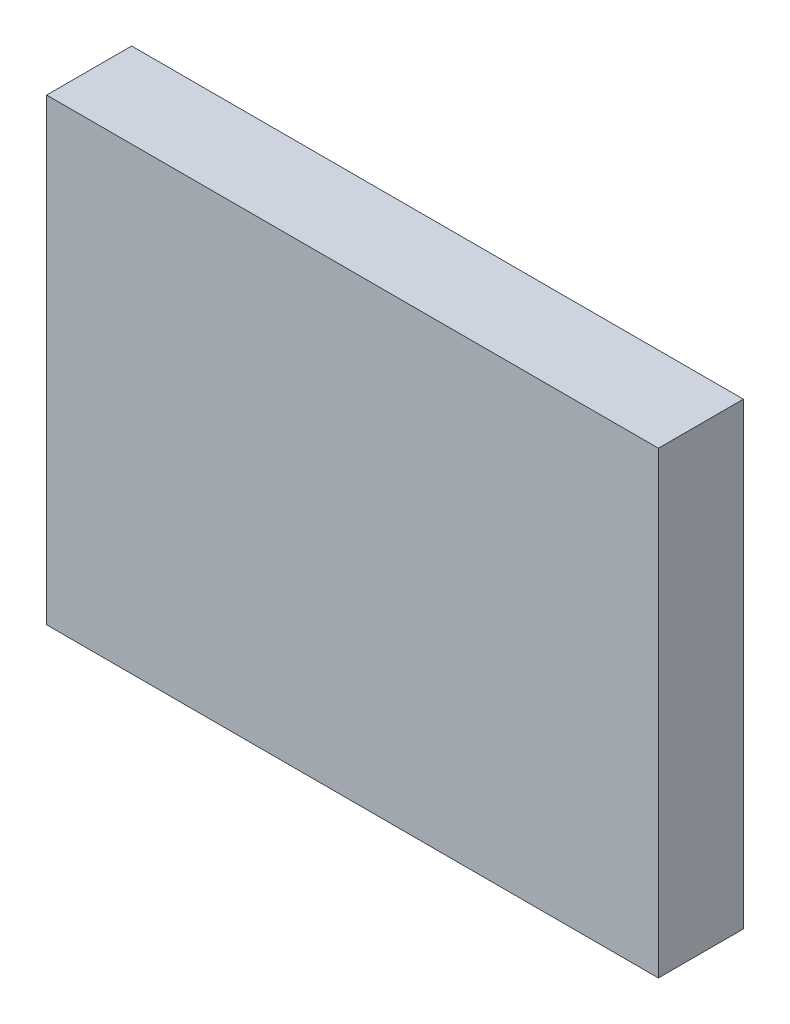
ISO-10303-21;
HEADER;
FILE_DESCRIPTION(('STEP AP214'),'2;1');
FILE_NAME('part.step','',(''),(''),'','','');
FILE_SCHEMA(('AUTOMOTIVE_DESIGN { 1 0 10303 214 1 1 1 1 }'));
ENDSEC;
DATA;
#1=APPLICATION_CONTEXT('core data for automotive mechanical design processes');
#2=APPLICATION_PROTOCOL_DEFINITION('international standard','automotive_design',2000,#1);
#3=PRODUCT_CONTEXT('',#1,'mechanical');
#4=PRODUCT('Part','Part','',(#3));
#5=PRODUCT_RELATED_PRODUCT_CATEGORY('part','',(#4));
#6=PRODUCT_DEFINITION_FORMATION('','',#4);
#7=PRODUCT_DEFINITION_CONTEXT('part definition',#1,'design');
#8=PRODUCT_DEFINITION('design','',#6,#7);
#9=PRODUCT_DEFINITION_SHAPE('','',#8);
#10=(LENGTH_UNIT() NAMED_UNIT(*) SI_UNIT(.MILLI.,.METRE.));
#11=(NAMED_UNIT(*) PLANE_ANGLE_UNIT() SI_UNIT($,.RADIAN.));
#12=(NAMED_UNIT(*) SI_UNIT($,.STERADIAN.) SOLID_ANGLE_UNIT());
#13=UNCERTAINTY_MEASURE_WITH_UNIT(LENGTH_MEASURE(1.E-05),#10,'distance_accuracy_value','');
#14=(GEOMETRIC_REPRESENTATION_CONTEXT(3) GLOBAL_UNCERTAINTY_ASSIGNED_CONTEXT((#13)) GLOBAL_UNIT_ASSIGNED_CONTEXT((#10,
#11,#12)) REPRESENTATION_CONTEXT('',''));
#15=CARTESIAN_POINT('',(0.,0.,0.));
#16=DIRECTION('',(0.,0.,1.));
#17=DIRECTION('',(1.,0.,0.));
#18=AXIS2_PLACEMENT_3D('',#15,#16,#17);
#19=CARTESIAN_POINT('',(180.,135.,50.));
#20=DIRECTION('',(-1.,0.,0.));
#21=DIRECTION('',(0.,0.,1.));
#22=AXIS2_PLACEMENT_3D('',#19,#20,#21);
#23=PLANE('',#22);
#24=DIRECTION('',(0.,1.,0.));
#25=VECTOR('',#24,1.);
#26=CARTESIAN_POINT('',(180.,135.,0.));
#27=LINE('',#26,#25);
#28=CARTESIAN_POINT('',(180.,-135.,0.));
#29=VERTEX_POINT('',#28);
#30=CARTESIAN_POINT('',(180.,135.,0.));
#31=VERTEX_POINT('',#30);
#32=EDGE_CURVE('E105',#29,#31,#27,.T.);
#33=ORIENTED_EDGE('',*,*,#32,.T.);
#34=DIRECTION('',(0.,0.,-1.));
#35=VECTOR('',#34,1.);
#36=CARTESIAN_POINT('',(180.,135.,50.));
#37=LINE('',#36,#35);
#38=CARTESIAN_POINT('',(180.,135.,50.));
#39=VERTEX_POINT('',#38);
#40=EDGE_CURVE('E11',#39,#31,#37,.T.);
#41=ORIENTED_EDGE('',*,*,#40,.F.);
#42=DIRECTION('',(0.,1.,0.));
#43=VECTOR('',#42,1.);
#44=CARTESIAN_POINT('',(180.,135.,50.));
#45=LINE('',#44,#43);
#46=CARTESIAN_POINT('',(180.,-135.,50.));
#47=VERTEX_POINT('',#46);
#48=EDGE_CURVE('E93',#47,#39,#45,.T.);
#49=ORIENTED_EDGE('',*,*,#48,.F.);
#50=DIRECTION('',(0.,0.,-1.));
#51=VECTOR('',#50,1.);
#52=CARTESIAN_POINT('',(180.,-135.,50.));
#53=LINE('',#52,#51);
#54=EDGE_CURVE('E101',#47,#29,#53,.T.);
#55=ORIENTED_EDGE('',*,*,#54,.T.);
#56=EDGE_LOOP('',(#33,#41,#49,#55));
#57=FACE_BOUND('',#56,.T.);
#58=ADVANCED_FACE('F41',(#57),#23,.F.);
#59=CARTESIAN_POINT('',(-180.,135.,50.));
#60=DIRECTION('',(0.,-1.,0.));
#61=DIRECTION('',(0.,0.,-1.));
#62=AXIS2_PLACEMENT_3D('',#59,#60,#61);
#63=PLANE('',#62);
#64=DIRECTION('',(-1.,0.,0.));
#65=VECTOR('',#64,1.);
#66=CARTESIAN_POINT('',(-180.,135.,0.));
#67=LINE('',#66,#65);
#68=CARTESIAN_POINT('',(-180.,135.,0.));
#69=VERTEX_POINT('',#68);
#70=EDGE_CURVE('E97',#31,#69,#67,.T.);
#71=ORIENTED_EDGE('',*,*,#70,.T.);
#72=DIRECTION('',(0.,0.,-1.));
#73=VECTOR('',#72,1.);
#74=CARTESIAN_POINT('',(-180.,135.,50.));
#75=LINE('',#74,#73);
#76=CARTESIAN_POINT('',(-180.,135.,50.));
#77=VERTEX_POINT('',#76);
#78=EDGE_CURVE('E49',#77,#69,#75,.T.);
#79=ORIENTED_EDGE('',*,*,#78,.F.);
#80=DIRECTION('',(-1.,0.,0.));
#81=VECTOR('',#80,1.);
#82=CARTESIAN_POINT('',(-180.,135.,50.));
#83=LINE('',#82,#81);
#84=EDGE_CURVE('E87',#39,#77,#83,.T.);
#85=ORIENTED_EDGE('',*,*,#84,.F.);
#86=ORIENTED_EDGE('',*,*,#40,.T.);
#87=EDGE_LOOP('',(#71,#79,#85,#86));
#88=FACE_BOUND('',#87,.T.);
#89=ADVANCED_FACE('F96',(#88),#63,.F.);
#90=CARTESIAN_POINT('',(-180.,135.,50.));
#91=DIRECTION('',(1.,0.,0.));
#92=DIRECTION('',(0.,0.,-1.));
#93=AXIS2_PLACEMENT_3D('',#90,#91,#92);
#94=PLANE('',#93);
#95=DIRECTION('',(0.,-1.,0.));
#96=VECTOR('',#95,1.);
#97=CARTESIAN_POINT('',(-180.,135.,0.));
#98=LINE('',#97,#96);
#99=CARTESIAN_POINT('',(-180.,-135.,0.));
#100=VERTEX_POINT('',#99);
#101=EDGE_CURVE('E74',#69,#100,#98,.T.);
#102=ORIENTED_EDGE('',*,*,#101,.T.);
#103=DIRECTION('',(0.,0.,-1.));
#104=VECTOR('',#103,1.);
#105=CARTESIAN_POINT('',(-180.,-135.,50.));
#106=LINE('',#105,#104);
#107=CARTESIAN_POINT('',(-180.,-135.,50.));
#108=VERTEX_POINT('',#107);
#109=EDGE_CURVE('E98',#108,#100,#106,.T.);
#110=ORIENTED_EDGE('',*,*,#109,.F.);
#111=DIRECTION('',(0.,-1.,0.));
#112=VECTOR('',#111,1.);
#113=CARTESIAN_POINT('',(-180.,135.,50.));
#114=LINE('',#113,#112);
#115=EDGE_CURVE('E91',#77,#108,#114,.T.);
#116=ORIENTED_EDGE('',*,*,#115,.F.);
#117=ORIENTED_EDGE('',*,*,#78,.T.);
#118=EDGE_LOOP('',(#102,#110,#116,#117));
#119=FACE_BOUND('',#118,.T.);
#120=ADVANCED_FACE('F99',(#119),#94,.F.);
#121=CARTESIAN_POINT('',(-180.,-135.,50.));
#122=DIRECTION('',(0.,1.,0.));
#123=DIRECTION('',(0.,0.,1.));
#124=AXIS2_PLACEMENT_3D('',#121,#122,#123);
#125=PLANE('',#124);
#126=DIRECTION('',(1.,0.,0.));
#127=VECTOR('',#126,1.);
#128=CARTESIAN_POINT('',(-180.,-135.,0.));
#129=LINE('',#128,#127);
#130=EDGE_CURVE('E80',#100,#29,#129,.T.);
#131=ORIENTED_EDGE('',*,*,#130,.T.);
#132=ORIENTED_EDGE('',*,*,#54,.F.);
#133=DIRECTION('',(1.,0.,0.));
#134=VECTOR('',#133,1.);
#135=CARTESIAN_POINT('',(-180.,-135.,50.));
#136=LINE('',#135,#134);
#137=EDGE_CURVE('E57',#108,#47,#136,.T.);
#138=ORIENTED_EDGE('',*,*,#137,.F.);
#139=ORIENTED_EDGE('',*,*,#109,.T.);
#140=EDGE_LOOP('',(#131,#132,#138,#139));
#141=FACE_BOUND('',#140,.T.);
#142=ADVANCED_FACE('F112',(#141),#125,.F.);
#143=CARTESIAN_POINT('',(0.,0.,50.));
#144=DIRECTION('',(0.,0.,1.));
#145=DIRECTION('',(1.,0.,0.));
#146=AXIS2_PLACEMENT_3D('',#143,#144,#145);
#147=PLANE('',#146);
#148=ORIENTED_EDGE('',*,*,#48,.T.);
#149=ORIENTED_EDGE('',*,*,#84,.T.);
#150=ORIENTED_EDGE('',*,*,#115,.T.);
#151=ORIENTED_EDGE('',*,*,#137,.T.);
#152=EDGE_LOOP('',(#148,#149,#150,#151));
#153=FACE_BOUND('',#152,.T.);
#154=ADVANCED_FACE('F89',(#153),#147,.T.);
#155=CARTESIAN_POINT('',(0.,0.,0.));
#156=DIRECTION('',(0.,0.,1.));
#157=DIRECTION('',(1.,0.,0.));
#158=AXIS2_PLACEMENT_3D('',#155,#156,#157);
#159=PLANE('',#158);
#160=ORIENTED_EDGE('',*,*,#32,.F.);
#161=ORIENTED_EDGE('',*,*,#130,.F.);
#162=ORIENTED_EDGE('',*,*,#101,.F.);
#163=ORIENTED_EDGE('',*,*,#70,.F.);
#164=EDGE_LOOP('',(#160,#161,#162,#163));
#165=FACE_BOUND('',#164,.T.);
#166=ADVANCED_FACE('F115',(#165),#159,.F.);
#167=CLOSED_SHELL('',(#58,#89,#120,#142,#154,#166));
#168=MANIFOLD_SOLID_BREP('B2',#167);
#169=ADVANCED_BREP_SHAPE_REPRESENTATION('',(#18,#168),#14);
#170=SHAPE_DEFINITION_REPRESENTATION(#9,#169);
ENDSEC;
END-ISO-10303-21;
